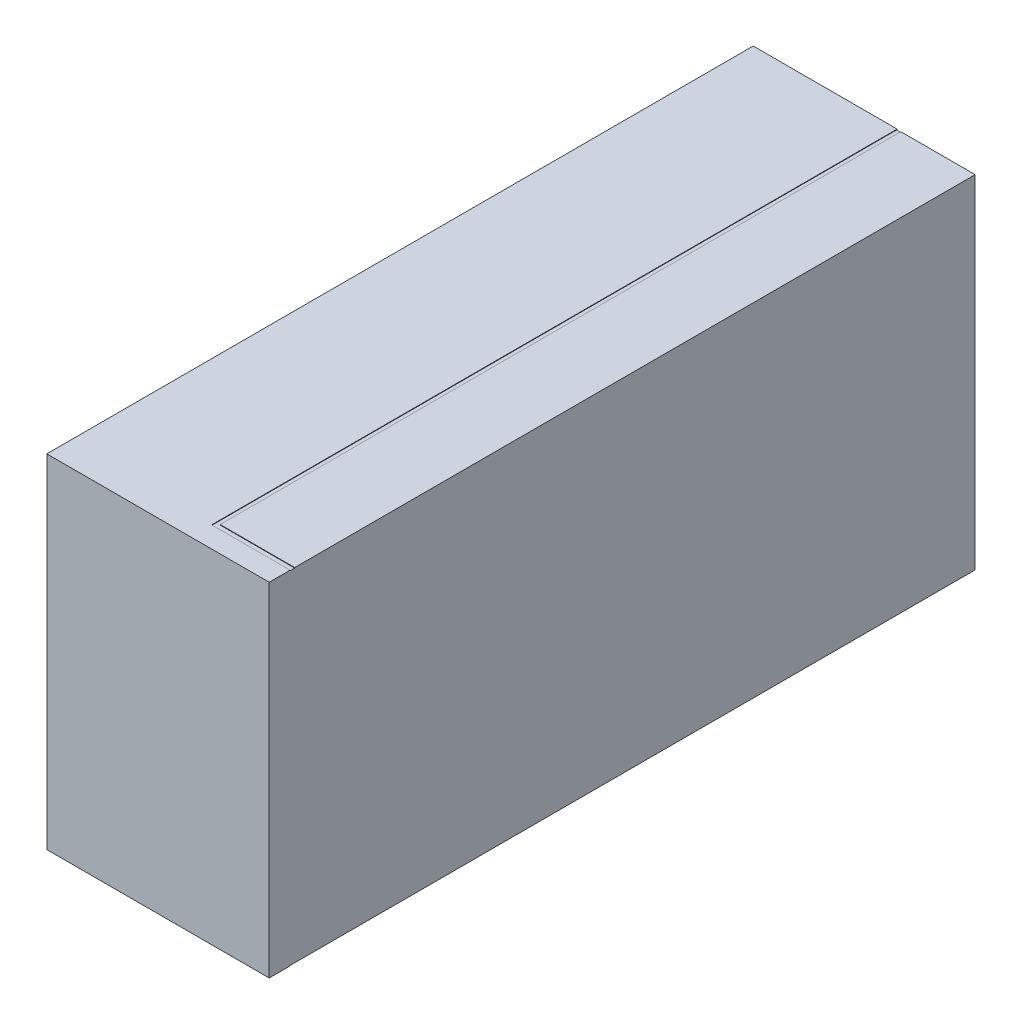
ISO-10303-21;
HEADER;
FILE_DESCRIPTION(('STEP AP214'),'2;1');
FILE_NAME('part.step','',(''),(''),'','','');
FILE_SCHEMA(('AUTOMOTIVE_DESIGN { 1 0 10303 214 1 1 1 1 }'));
ENDSEC;
DATA;
#1=APPLICATION_CONTEXT('core data for automotive mechanical design processes');
#2=APPLICATION_PROTOCOL_DEFINITION('international standard','automotive_design',2000,#1);
#3=PRODUCT_CONTEXT('',#1,'mechanical');
#4=PRODUCT('Part','Part','',(#3));
#5=PRODUCT_RELATED_PRODUCT_CATEGORY('part','',(#4));
#6=PRODUCT_DEFINITION_FORMATION('','',#4);
#7=PRODUCT_DEFINITION_CONTEXT('part definition',#1,'design');
#8=PRODUCT_DEFINITION('design','',#6,#7);
#9=PRODUCT_DEFINITION_SHAPE('','',#8);
#10=(LENGTH_UNIT() NAMED_UNIT(*) SI_UNIT(.MILLI.,.METRE.));
#11=(NAMED_UNIT(*) PLANE_ANGLE_UNIT() SI_UNIT($,.RADIAN.));
#12=(NAMED_UNIT(*) SI_UNIT($,.STERADIAN.) SOLID_ANGLE_UNIT());
#13=UNCERTAINTY_MEASURE_WITH_UNIT(LENGTH_MEASURE(1.E-05),#10,'distance_accuracy_value','');
#14=(GEOMETRIC_REPRESENTATION_CONTEXT(3) GLOBAL_UNCERTAINTY_ASSIGNED_CONTEXT((#13)) GLOBAL_UNIT_ASSIGNED_CONTEXT((#10,
#11,#12)) REPRESENTATION_CONTEXT('',''));
#15=CARTESIAN_POINT('',(0.,0.,0.));
#16=DIRECTION('',(0.,0.,1.));
#17=DIRECTION('',(1.,0.,0.));
#18=AXIS2_PLACEMENT_3D('',#15,#16,#17);
#19=CARTESIAN_POINT('',(3.,0.,0.));
#20=DIRECTION('',(1.,0.,0.));
#21=DIRECTION('',(0.,0.,-1.));
#22=AXIS2_PLACEMENT_3D('',#19,#20,#21);
#23=PLANE('',#22);
#24=DIRECTION('',(0.,0.,1.));
#25=VECTOR('',#24,1.);
#26=CARTESIAN_POINT('',(3.,-0.345095944246211,-32.2670870125813));
#27=LINE('',#26,#25);
#28=CARTESIAN_POINT('',(3.,-0.345095944246211,-30.5350362050125));
#29=VERTEX_POINT('',#28);
#30=CARTESIAN_POINT('',(3.,-0.345095944246211,-21.9991378201502));
#31=VERTEX_POINT('',#30);
#32=EDGE_CURVE('E259',#29,#31,#27,.T.);
#33=ORIENTED_EDGE('',*,*,#32,.T.);
#34=DIRECTION('',(0.,1.,0.));
#35=VECTOR('',#34,1.);
#36=CARTESIAN_POINT('',(3.,12.9228532481849,-21.9991378201502));
#37=LINE('',#36,#35);
#38=CARTESIAN_POINT('',(3.,11.190802440616,-21.9991378201502));
#39=VERTEX_POINT('',#38);
#40=EDGE_CURVE('E273',#39,#31,#37,.F.);
#41=ORIENTED_EDGE('',*,*,#40,.F.);
#42=DIRECTION('',(0.,0.,-1.));
#43=VECTOR('',#42,1.);
#44=CARTESIAN_POINT('',(3.,11.190802440616,-32.2670870125813));
#45=LINE('',#44,#43);
#46=CARTESIAN_POINT('',(3.,11.190802440616,-30.5350362050125));
#47=VERTEX_POINT('',#46);
#48=EDGE_CURVE('E276',#47,#39,#45,.F.);
#49=ORIENTED_EDGE('',*,*,#48,.F.);
#50=DIRECTION('',(0.,-1.,0.));
#51=VECTOR('',#50,1.);
#52=CARTESIAN_POINT('',(3.,12.9228532481849,-30.5350362050125));
#53=LINE('',#52,#51);
#54=EDGE_CURVE('E268',#47,#29,#53,.T.);
#55=ORIENTED_EDGE('',*,*,#54,.T.);
#56=EDGE_LOOP('',(#33,#41,#49,#55));
#57=FACE_BOUND('',#56,.T.);
#58=DIRECTION('',(0.,0.,1.));
#59=VECTOR('',#58,1.);
#60=CARTESIAN_POINT('',(3.,6.91288799864509,-29.9923067551688));
#61=LINE('',#60,#59);
#62=CARTESIAN_POINT('',(3.,6.91288799864509,-29.9923067551688));
#63=VERTEX_POINT('',#62);
#64=CARTESIAN_POINT('',(3.,6.91288799864509,-22.4836669984834));
#65=VERTEX_POINT('',#64);
#66=EDGE_CURVE('E225',#63,#65,#61,.T.);
#67=ORIENTED_EDGE('',*,*,#66,.F.);
#68=DIRECTION('',(0.,-1.,0.));
#69=VECTOR('',#68,1.);
#70=CARTESIAN_POINT('',(3.,10.1848527076385,-29.9923067551688));
#71=LINE('',#70,#69);
#72=CARTESIAN_POINT('',(3.,10.1848527076385,-29.9923067551688));
#73=VERTEX_POINT('',#72);
#74=EDGE_CURVE('E220',#73,#63,#71,.T.);
#75=ORIENTED_EDGE('',*,*,#74,.F.);
#76=DIRECTION('',(0.,0.,1.));
#77=VECTOR('',#76,1.);
#78=CARTESIAN_POINT('',(3.,10.1848527076385,-29.9923067551688));
#79=LINE('',#78,#77);
#80=CARTESIAN_POINT('',(3.,10.1848527076385,-22.4836669984834));
#81=VERTEX_POINT('',#80);
#82=EDGE_CURVE('E54',#73,#81,#79,.T.);
#83=ORIENTED_EDGE('',*,*,#82,.T.);
#84=DIRECTION('',(0.,-1.,0.));
#85=VECTOR('',#84,1.);
#86=CARTESIAN_POINT('',(3.,10.1848527076385,-22.4836669984834));
#87=LINE('',#86,#85);
#88=EDGE_CURVE('E49',#81,#65,#87,.T.);
#89=ORIENTED_EDGE('',*,*,#88,.T.);
#90=EDGE_LOOP('',(#67,#75,#83,#89));
#91=FACE_BOUND('',#90,.T.);
#92=ADVANCED_FACE('F34',(#57,#91),#23,.F.);
#93=CARTESIAN_POINT('',(0.,-16.325,0.));
#94=DIRECTION('',(0.,-1.,0.));
#95=DIRECTION('',(0.,0.,-1.));
#96=AXIS2_PLACEMENT_3D('',#93,#94,#95);
#97=PLANE('',#96);
#98=DIRECTION('',(0.,0.,-1.));
#99=VECTOR('',#98,1.);
#100=CARTESIAN_POINT('',(14.1102058435065,-16.325,-33.71));
#101=LINE('',#100,#99);
#102=CARTESIAN_POINT('',(14.1102058435065,-16.325,31.3360803535333));
#103=VERTEX_POINT('',#102);
#104=CARTESIAN_POINT('',(14.1102058435065,-16.325,-33.7));
#105=VERTEX_POINT('',#104);
#106=EDGE_CURVE('E293',#103,#105,#101,.T.);
#107=ORIENTED_EDGE('',*,*,#106,.F.);
#108=DIRECTION('',(-1.,0.,0.));
#109=VECTOR('',#108,1.);
#110=CARTESIAN_POINT('',(21.25,-16.325,31.3360803535333));
#111=LINE('',#110,#109);
#112=CARTESIAN_POINT('',(21.25,-16.325,31.3360803535333));
#113=VERTEX_POINT('',#112);
#114=EDGE_CURVE('E262',#113,#103,#111,.T.);
#115=ORIENTED_EDGE('',*,*,#114,.F.);
#116=DIRECTION('',(0.,0.,1.));
#117=VECTOR('',#116,1.);
#118=CARTESIAN_POINT('',(21.25,-16.325,-33.7));
#119=LINE('',#118,#117);
#120=CARTESIAN_POINT('',(21.25,-16.325,31.75));
#121=VERTEX_POINT('',#120);
#122=EDGE_CURVE('E345',#113,#121,#119,.T.);
#123=ORIENTED_EDGE('',*,*,#122,.T.);
#124=DIRECTION('',(-1.,0.,0.));
#125=VECTOR('',#124,1.);
#126=CARTESIAN_POINT('',(21.25,-16.325,31.75));
#127=LINE('',#126,#125);
#128=CARTESIAN_POINT('',(13.75,-16.325,31.75));
#129=VERTEX_POINT('',#128);
#130=EDGE_CURVE('E347',#121,#129,#127,.T.);
#131=ORIENTED_EDGE('',*,*,#130,.T.);
#132=DIRECTION('',(0.,0.,-1.));
#133=VECTOR('',#132,1.);
#134=CARTESIAN_POINT('',(13.75,-16.325,-33.7));
#135=LINE('',#134,#133);
#136=CARTESIAN_POINT('',(13.75,-16.325,-33.7));
#137=VERTEX_POINT('',#136);
#138=EDGE_CURVE('E350',#129,#137,#135,.T.);
#139=ORIENTED_EDGE('',*,*,#138,.T.);
#140=DIRECTION('',(1.,0.,0.));
#141=VECTOR('',#140,1.);
#142=CARTESIAN_POINT('',(21.25,-16.325,-33.7));
#143=LINE('',#142,#141);
#144=EDGE_CURVE('E352',#137,#105,#143,.T.);
#145=ORIENTED_EDGE('',*,*,#144,.T.);
#146=EDGE_LOOP('',(#107,#115,#123,#131,#139,#145));
#147=FACE_BOUND('',#146,.T.);
#148=ADVANCED_FACE('F459',(#147),#97,.T.);
#149=CARTESIAN_POINT('',(0.,0.,-33.7));
#150=DIRECTION('',(0.,0.,1.));
#151=DIRECTION('',(1.,0.,0.));
#152=AXIS2_PLACEMENT_3D('',#149,#150,#151);
#153=PLANE('',#152);
#154=DIRECTION('',(0.,1.,0.));
#155=VECTOR('',#154,1.);
#156=CARTESIAN_POINT('',(14.3548517665527,16.375,-33.7));
#157=LINE('',#156,#155);
#158=CARTESIAN_POINT('',(14.3548517665527,-16.325,-33.7));
#159=VERTEX_POINT('',#158);
#160=CARTESIAN_POINT('',(14.3548517665527,16.375,-33.7));
#161=VERTEX_POINT('',#160);
#162=EDGE_CURVE('E306',#159,#161,#157,.T.);
#163=ORIENTED_EDGE('',*,*,#162,.F.);
#164=DIRECTION('',(1.,0.,0.));
#165=VECTOR('',#164,1.);
#166=CARTESIAN_POINT('',(0.,-16.325,-33.7));
#167=LINE('',#166,#165);
#168=EDGE_CURVE('E304',#105,#159,#167,.T.);
#169=ORIENTED_EDGE('',*,*,#168,.F.);
#170=ORIENTED_EDGE('',*,*,#144,.F.);
#171=DIRECTION('',(0.,1.,0.));
#172=VECTOR('',#171,1.);
#173=CARTESIAN_POINT('',(13.75,16.325,-33.7));
#174=LINE('',#173,#172);
#175=CARTESIAN_POINT('',(13.75,16.325,-33.7));
#176=VERTEX_POINT('',#175);
#177=EDGE_CURVE('E361',#137,#176,#174,.T.);
#178=ORIENTED_EDGE('',*,*,#177,.T.);
#179=DIRECTION('',(1.,0.,0.));
#180=VECTOR('',#179,1.);
#181=CARTESIAN_POINT('',(13.75,16.325,-33.7));
#182=LINE('',#181,#180);
#183=CARTESIAN_POINT('',(14.1300583955491,16.325,-33.7));
#184=VERTEX_POINT('',#183);
#185=EDGE_CURVE('E364',#176,#184,#182,.T.);
#186=ORIENTED_EDGE('',*,*,#185,.T.);
#187=DIRECTION('',(0.,-1.,0.));
#188=VECTOR('',#187,1.);
#189=CARTESIAN_POINT('',(14.1300583955491,16.375,-33.7));
#190=LINE('',#189,#188);
#191=CARTESIAN_POINT('',(14.1300583955491,16.375,-33.7));
#192=VERTEX_POINT('',#191);
#193=EDGE_CURVE('E341',#192,#184,#190,.T.);
#194=ORIENTED_EDGE('',*,*,#193,.F.);
#195=DIRECTION('',(-1.,0.,0.));
#196=VECTOR('',#195,1.);
#197=CARTESIAN_POINT('',(21.25,16.375,-33.7));
#198=LINE('',#197,#196);
#199=EDGE_CURVE('E324',#161,#192,#198,.T.);
#200=ORIENTED_EDGE('',*,*,#199,.F.);
#201=EDGE_LOOP('',(#163,#169,#170,#178,#186,#194,#200));
#202=FACE_BOUND('',#201,.T.);
#203=ADVANCED_FACE('F454',(#202),#153,.F.);
#204=CARTESIAN_POINT('',(21.25,16.325,33.75));
#205=DIRECTION('',(0.,-1.,0.));
#206=DIRECTION('',(0.,0.,-1.));
#207=AXIS2_PLACEMENT_3D('',#204,#205,#206);
#208=PLANE('',#207);
#209=DIRECTION('',(0.,0.,1.));
#210=VECTOR('',#209,1.);
#211=CARTESIAN_POINT('',(14.1300583955491,16.325,-33.7));
#212=LINE('',#211,#210);
#213=CARTESIAN_POINT('',(14.1300583955491,16.325,31.3137362520566));
#214=VERTEX_POINT('',#213);
#215=EDGE_CURVE('E321',#184,#214,#212,.T.);
#216=ORIENTED_EDGE('',*,*,#215,.F.);
#217=ORIENTED_EDGE('',*,*,#185,.F.);
#218=DIRECTION('',(0.,0.,-1.));
#219=VECTOR('',#218,1.);
#220=CARTESIAN_POINT('',(13.75,16.325,-33.75));
#221=LINE('',#220,#219);
#222=CARTESIAN_POINT('',(13.75,16.325,31.7470793210036));
#223=VERTEX_POINT('',#222);
#224=EDGE_CURVE('E374',#223,#176,#221,.T.);
#225=ORIENTED_EDGE('',*,*,#224,.F.);
#226=DIRECTION('',(-1.,0.,0.));
#227=VECTOR('',#226,1.);
#228=CARTESIAN_POINT('',(13.75,16.325,31.7470793210036));
#229=LINE('',#228,#227);
#230=CARTESIAN_POINT('',(21.25,16.325,31.7470793210036));
#231=VERTEX_POINT('',#230);
#232=EDGE_CURVE('E371',#231,#223,#229,.T.);
#233=ORIENTED_EDGE('',*,*,#232,.F.);
#234=DIRECTION('',(0.,0.,1.));
#235=VECTOR('',#234,1.);
#236=CARTESIAN_POINT('',(21.25,16.325,33.75));
#237=LINE('',#236,#235);
#238=CARTESIAN_POINT('',(21.25,16.325,31.3137362520566));
#239=VERTEX_POINT('',#238);
#240=EDGE_CURVE('E370',#239,#231,#237,.T.);
#241=ORIENTED_EDGE('',*,*,#240,.F.);
#242=DIRECTION('',(1.,0.,0.));
#243=VECTOR('',#242,1.);
#244=CARTESIAN_POINT('',(21.25,16.325,31.3137362520566));
#245=LINE('',#244,#243);
#246=EDGE_CURVE('E325',#214,#239,#245,.T.);
#247=ORIENTED_EDGE('',*,*,#246,.F.);
#248=EDGE_LOOP('',(#216,#217,#225,#233,#241,#247));
#249=FACE_BOUND('',#248,.T.);
#250=ADVANCED_FACE('F448',(#249),#208,.F.);
#251=CARTESIAN_POINT('',(21.25,-16.375,-33.75));
#252=DIRECTION('',(0.,0.,1.));
#253=DIRECTION('',(1.,0.,0.));
#254=AXIS2_PLACEMENT_3D('',#251,#252,#253);
#255=PLANE('',#254);
#256=CARTESIAN_POINT('',(10.25,-10.875,-33.75));
#257=DIRECTION('',(0.,0.,-1.));
#258=DIRECTION('',(-1.,0.,0.));
#259=AXIS2_PLACEMENT_3D('',#256,#257,#258);
#260=CIRCLE('',#259,2.5);
#261=CARTESIAN_POINT('',(7.75,-10.875,-33.75));
#262=VERTEX_POINT('',#261);
#263=EDGE_CURVE('E792',#262,#262,#260,.T.);
#264=ORIENTED_EDGE('',*,*,#263,.F.);
#265=EDGE_LOOP('',(#264));
#266=FACE_BOUND('',#265,.T.);
#267=DIRECTION('',(0.,-1.,0.));
#268=VECTOR('',#267,1.);
#269=CARTESIAN_POINT('',(13.75,113.845949197697,-33.75));
#270=LINE('',#269,#268);
#271=CARTESIAN_POINT('',(13.75,16.375,-33.75));
#272=VERTEX_POINT('',#271);
#273=CARTESIAN_POINT('',(13.75,-16.375,-33.75));
#274=VERTEX_POINT('',#273);
#275=EDGE_CURVE('E389',#272,#274,#270,.T.);
#276=ORIENTED_EDGE('',*,*,#275,.T.);
#277=DIRECTION('',(-1.,0.,0.));
#278=VECTOR('',#277,1.);
#279=CARTESIAN_POINT('',(21.25,-16.375,-33.75));
#280=LINE('',#279,#278);
#281=CARTESIAN_POINT('',(0.,-16.375,-33.75));
#282=VERTEX_POINT('',#281);
#283=EDGE_CURVE('E401',#274,#282,#280,.T.);
#284=ORIENTED_EDGE('',*,*,#283,.T.);
#285=DIRECTION('',(0.,1.,0.));
#286=VECTOR('',#285,1.);
#287=CARTESIAN_POINT('',(0.,-16.375,-33.75));
#288=LINE('',#287,#286);
#289=CARTESIAN_POINT('',(0.,16.375,-33.75));
#290=VERTEX_POINT('',#289);
#291=EDGE_CURVE('E391',#282,#290,#288,.T.);
#292=ORIENTED_EDGE('',*,*,#291,.T.);
#293=DIRECTION('',(-1.,0.,0.));
#294=VECTOR('',#293,1.);
#295=CARTESIAN_POINT('',(21.25,16.375,-33.75));
#296=LINE('',#295,#294);
#297=EDGE_CURVE('E11',#272,#290,#296,.T.);
#298=ORIENTED_EDGE('',*,*,#297,.F.);
#299=EDGE_LOOP('',(#276,#284,#292,#298));
#300=FACE_BOUND('',#299,.T.);
#301=ADVANCED_FACE('F36',(#266,#300),#255,.F.);
#302=CARTESIAN_POINT('',(21.25,16.375,33.75));
#303=DIRECTION('',(0.,-1.,0.));
#304=DIRECTION('',(0.,0.,-1.));
#305=AXIS2_PLACEMENT_3D('',#302,#303,#304);
#306=PLANE('',#305);
#307=DIRECTION('',(0.,0.,-1.));
#308=VECTOR('',#307,1.);
#309=CARTESIAN_POINT('',(13.75,16.375,-33.75));
#310=LINE('',#309,#308);
#311=CARTESIAN_POINT('',(13.75,16.375,31.7470793210036));
#312=VERTEX_POINT('',#311);
#313=EDGE_CURVE('E379',#312,#272,#310,.T.);
#314=ORIENTED_EDGE('',*,*,#313,.T.);
#315=ORIENTED_EDGE('',*,*,#297,.T.);
#316=DIRECTION('',(0.,0.,1.));
#317=VECTOR('',#316,1.);
#318=CARTESIAN_POINT('',(0.,16.375,33.75));
#319=LINE('',#318,#317);
#320=CARTESIAN_POINT('',(0.,16.375,33.75));
#321=VERTEX_POINT('',#320);
#322=EDGE_CURVE('E404',#290,#321,#319,.T.);
#323=ORIENTED_EDGE('',*,*,#322,.T.);
#324=DIRECTION('',(-1.,0.,0.));
#325=VECTOR('',#324,1.);
#326=CARTESIAN_POINT('',(21.25,16.375,33.75));
#327=LINE('',#326,#325);
#328=CARTESIAN_POINT('',(21.25,16.375,33.75));
#329=VERTEX_POINT('',#328);
#330=EDGE_CURVE('E42',#329,#321,#327,.T.);
#331=ORIENTED_EDGE('',*,*,#330,.F.);
#332=DIRECTION('',(0.,0.,1.));
#333=VECTOR('',#332,1.);
#334=CARTESIAN_POINT('',(21.25,16.375,33.75));
#335=LINE('',#334,#333);
#336=CARTESIAN_POINT('',(21.25,16.375,31.7470793210036));
#337=VERTEX_POINT('',#336);
#338=EDGE_CURVE('E393',#337,#329,#335,.T.);
#339=ORIENTED_EDGE('',*,*,#338,.F.);
#340=DIRECTION('',(-1.,0.,0.));
#341=VECTOR('',#340,1.);
#342=CARTESIAN_POINT('',(13.75,16.375,31.7470793210036));
#343=LINE('',#342,#341);
#344=EDGE_CURVE('E375',#337,#312,#343,.T.);
#345=ORIENTED_EDGE('',*,*,#344,.T.);
#346=EDGE_LOOP('',(#314,#315,#323,#331,#339,#345));
#347=FACE_BOUND('',#346,.T.);
#348=ADVANCED_FACE('F437',(#347),#306,.F.);
#349=CARTESIAN_POINT('',(21.25,0.,0.));
#350=DIRECTION('',(-1.,0.,0.));
#351=DIRECTION('',(0.,0.,1.));
#352=AXIS2_PLACEMENT_3D('',#349,#350,#351);
#353=PLANE('',#352);
#354=DIRECTION('',(0.,0.,-1.));
#355=VECTOR('',#354,1.);
#356=CARTESIAN_POINT('',(21.25,-16.375,33.75));
#357=LINE('',#356,#355);
#358=CARTESIAN_POINT('',(21.25,-16.375,33.75));
#359=VERTEX_POINT('',#358);
#360=CARTESIAN_POINT('',(21.25,-16.375,31.75));
#361=VERTEX_POINT('',#360);
#362=EDGE_CURVE('E398',#359,#361,#357,.T.);
#363=ORIENTED_EDGE('',*,*,#362,.T.);
#364=DIRECTION('',(0.,-1.,0.));
#365=VECTOR('',#364,1.);
#366=CARTESIAN_POINT('',(21.25,-16.325,31.75));
#367=LINE('',#366,#365);
#368=EDGE_CURVE('E355',#121,#361,#367,.T.);
#369=ORIENTED_EDGE('',*,*,#368,.F.);
#370=ORIENTED_EDGE('',*,*,#122,.F.);
#371=DIRECTION('',(0.,1.,0.));
#372=VECTOR('',#371,1.);
#373=CARTESIAN_POINT('',(21.25,-16.335,31.3360803535333));
#374=LINE('',#373,#372);
#375=CARTESIAN_POINT('',(21.25,-16.335,31.3360803535333));
#376=VERTEX_POINT('',#375);
#377=EDGE_CURVE('E302',#376,#113,#374,.T.);
#378=ORIENTED_EDGE('',*,*,#377,.F.);
#379=DIRECTION('',(0.,0.,1.));
#380=VECTOR('',#379,1.);
#381=CARTESIAN_POINT('',(21.25,-16.335,-33.71));
#382=LINE('',#381,#380);
#383=CARTESIAN_POINT('',(21.25,-16.335,-33.71));
#384=VERTEX_POINT('',#383);
#385=EDGE_CURVE('E279',#384,#376,#382,.T.);
#386=ORIENTED_EDGE('',*,*,#385,.F.);
#387=DIRECTION('',(0.,-1.,0.));
#388=VECTOR('',#387,1.);
#389=CARTESIAN_POINT('',(21.25,16.375,-33.71));
#390=LINE('',#389,#388);
#391=CARTESIAN_POINT('',(21.25,16.375,-33.71));
#392=VERTEX_POINT('',#391);
#393=EDGE_CURVE('E307',#392,#384,#390,.T.);
#394=ORIENTED_EDGE('',*,*,#393,.F.);
#395=DIRECTION('',(0.,0.,-1.));
#396=VECTOR('',#395,1.);
#397=CARTESIAN_POINT('',(21.25,16.375,-33.7));
#398=LINE('',#397,#396);
#399=CARTESIAN_POINT('',(21.25,16.375,31.3137362520566));
#400=VERTEX_POINT('',#399);
#401=EDGE_CURVE('E322',#400,#392,#398,.T.);
#402=ORIENTED_EDGE('',*,*,#401,.F.);
#403=DIRECTION('',(0.,-1.,0.));
#404=VECTOR('',#403,1.);
#405=CARTESIAN_POINT('',(21.25,16.375,31.3137362520566));
#406=LINE('',#405,#404);
#407=EDGE_CURVE('E331',#400,#239,#406,.T.);
#408=ORIENTED_EDGE('',*,*,#407,.T.);
#409=ORIENTED_EDGE('',*,*,#240,.T.);
#410=DIRECTION('',(0.,-1.,0.));
#411=VECTOR('',#410,1.);
#412=CARTESIAN_POINT('',(21.25,113.845949197697,31.7470793210036));
#413=LINE('',#412,#411);
#414=EDGE_CURVE('E378',#337,#231,#413,.T.);
#415=ORIENTED_EDGE('',*,*,#414,.F.);
#416=ORIENTED_EDGE('',*,*,#338,.T.);
#417=DIRECTION('',(0.,-1.,0.));
#418=VECTOR('',#417,1.);
#419=CARTESIAN_POINT('',(21.25,-16.375,33.75));
#420=LINE('',#419,#418);
#421=EDGE_CURVE('E395',#329,#359,#420,.T.);
#422=ORIENTED_EDGE('',*,*,#421,.T.);
#423=EDGE_LOOP('',(#363,#369,#370,#378,#386,#394,#402,#408,#409,#415,#416,#422));
#424=FACE_BOUND('',#423,.T.);
#425=ADVANCED_FACE('F434',(#424),#353,.F.);
#426=CARTESIAN_POINT('',(21.25,-16.375,33.75));
#427=DIRECTION('',(0.,0.,-1.));
#428=DIRECTION('',(-1.,0.,0.));
#429=AXIS2_PLACEMENT_3D('',#426,#427,#428);
#430=PLANE('',#429);
#431=DIRECTION('',(0.,-1.,0.));
#432=VECTOR('',#431,1.);
#433=CARTESIAN_POINT('',(0.,-16.375,33.75));
#434=LINE('',#433,#432);
#435=CARTESIAN_POINT('',(0.,-16.375,33.75));
#436=VERTEX_POINT('',#435);
#437=EDGE_CURVE('E406',#321,#436,#434,.T.);
#438=ORIENTED_EDGE('',*,*,#437,.T.);
#439=DIRECTION('',(-1.,0.,0.));
#440=VECTOR('',#439,1.);
#441=CARTESIAN_POINT('',(21.25,-16.375,33.75));
#442=LINE('',#441,#440);
#443=EDGE_CURVE('E411',#359,#436,#442,.T.);
#444=ORIENTED_EDGE('',*,*,#443,.F.);
#445=ORIENTED_EDGE('',*,*,#421,.F.);
#446=ORIENTED_EDGE('',*,*,#330,.T.);
#447=EDGE_LOOP('',(#438,#444,#445,#446));
#448=FACE_BOUND('',#447,.T.);
#449=ADVANCED_FACE('F418',(#448),#430,.F.);
#450=CARTESIAN_POINT('',(21.25,-16.375,33.75));
#451=DIRECTION('',(0.,1.,0.));
#452=DIRECTION('',(0.,0.,1.));
#453=AXIS2_PLACEMENT_3D('',#450,#451,#452);
#454=PLANE('',#453);
#455=DIRECTION('',(0.,0.,-1.));
#456=VECTOR('',#455,1.);
#457=CARTESIAN_POINT('',(13.75,-16.375,-33.7));
#458=LINE('',#457,#456);
#459=CARTESIAN_POINT('',(13.75,-16.375,31.75));
#460=VERTEX_POINT('',#459);
#461=EDGE_CURVE('E367',#460,#274,#458,.T.);
#462=ORIENTED_EDGE('',*,*,#461,.F.);
#463=DIRECTION('',(-1.,0.,0.));
#464=VECTOR('',#463,1.);
#465=CARTESIAN_POINT('',(21.25,-16.375,31.75));
#466=LINE('',#465,#464);
#467=EDGE_CURVE('E344',#361,#460,#466,.T.);
#468=ORIENTED_EDGE('',*,*,#467,.F.);
#469=ORIENTED_EDGE('',*,*,#362,.F.);
#470=ORIENTED_EDGE('',*,*,#443,.T.);
#471=DIRECTION('',(0.,0.,-1.));
#472=VECTOR('',#471,1.);
#473=CARTESIAN_POINT('',(0.,-16.375,33.75));
#474=LINE('',#473,#472);
#475=EDGE_CURVE('E396',#436,#282,#474,.T.);
#476=ORIENTED_EDGE('',*,*,#475,.T.);
#477=ORIENTED_EDGE('',*,*,#283,.F.);
#478=EDGE_LOOP('',(#462,#468,#469,#470,#476,#477));
#479=FACE_BOUND('',#478,.T.);
#480=ADVANCED_FACE('F429',(#479),#454,.F.);
#481=CARTESIAN_POINT('',(0.,0.,0.));
#482=DIRECTION('',(-1.,0.,0.));
#483=DIRECTION('',(0.,0.,1.));
#484=AXIS2_PLACEMENT_3D('',#481,#482,#483);
#485=PLANE('',#484);
#486=DIRECTION('',(0.,0.,1.));
#487=VECTOR('',#486,1.);
#488=CARTESIAN_POINT('',(0.,-2.07714675181509,-32.2670870125813));
#489=LINE('',#488,#487);
#490=CARTESIAN_POINT('',(0.,-2.07714675181509,-32.2670870125813));
#491=VERTEX_POINT('',#490);
#492=CARTESIAN_POINT('',(0.,-2.07714675181509,-20.2670870125813));
#493=VERTEX_POINT('',#492);
#494=EDGE_CURVE('E227',#491,#493,#489,.T.);
#495=ORIENTED_EDGE('',*,*,#494,.F.);
#496=DIRECTION('',(0.,-1.,0.));
#497=VECTOR('',#496,1.);
#498=CARTESIAN_POINT('',(0.,12.9228532481849,-32.2670870125813));
#499=LINE('',#498,#497);
#500=CARTESIAN_POINT('',(0.,12.9228532481849,-32.2670870125813));
#501=VERTEX_POINT('',#500);
#502=EDGE_CURVE('E256',#501,#491,#499,.T.);
#503=ORIENTED_EDGE('',*,*,#502,.F.);
#504=DIRECTION('',(0.,0.,1.));
#505=VECTOR('',#504,1.);
#506=CARTESIAN_POINT('',(0.,12.9228532481849,-32.2670870125813));
#507=LINE('',#506,#505);
#508=CARTESIAN_POINT('',(0.,12.9228532481849,-20.2670870125813));
#509=VERTEX_POINT('',#508);
#510=EDGE_CURVE('E253',#501,#509,#507,.T.);
#511=ORIENTED_EDGE('',*,*,#510,.T.);
#512=DIRECTION('',(0.,-1.,0.));
#513=VECTOR('',#512,1.);
#514=CARTESIAN_POINT('',(0.,12.9228532481849,-20.2670870125813));
#515=LINE('',#514,#513);
#516=EDGE_CURVE('E250',#509,#493,#515,.T.);
#517=ORIENTED_EDGE('',*,*,#516,.T.);
#518=EDGE_LOOP('',(#495,#503,#511,#517));
#519=FACE_BOUND('',#518,.T.);
#520=ORIENTED_EDGE('',*,*,#291,.F.);
#521=ORIENTED_EDGE('',*,*,#475,.F.);
#522=ORIENTED_EDGE('',*,*,#437,.F.);
#523=ORIENTED_EDGE('',*,*,#322,.F.);
#524=EDGE_LOOP('',(#520,#521,#522,#523));
#525=FACE_BOUND('',#524,.T.);
#526=ADVANCED_FACE('F426',(#519,#525),#485,.T.);
#527=CARTESIAN_POINT('',(13.75,113.845949197697,-33.75));
#528=DIRECTION('',(1.,0.,0.));
#529=DIRECTION('',(0.,0.,-1.));
#530=AXIS2_PLACEMENT_3D('',#527,#528,#529);
#531=PLANE('',#530);
#532=ORIENTED_EDGE('',*,*,#313,.F.);
#533=DIRECTION('',(0.,-1.,0.));
#534=VECTOR('',#533,1.);
#535=CARTESIAN_POINT('',(13.75,113.845949197697,31.7470793210036));
#536=LINE('',#535,#534);
#537=EDGE_CURVE('E386',#312,#223,#536,.T.);
#538=ORIENTED_EDGE('',*,*,#537,.T.);
#539=ORIENTED_EDGE('',*,*,#224,.T.);
#540=ORIENTED_EDGE('',*,*,#177,.F.);
#541=ORIENTED_EDGE('',*,*,#138,.F.);
#542=DIRECTION('',(0.,-1.,0.));
#543=VECTOR('',#542,1.);
#544=CARTESIAN_POINT('',(13.75,-16.325,31.75));
#545=LINE('',#544,#543);
#546=EDGE_CURVE('E358',#129,#460,#545,.T.);
#547=ORIENTED_EDGE('',*,*,#546,.T.);
#548=ORIENTED_EDGE('',*,*,#461,.T.);
#549=ORIENTED_EDGE('',*,*,#275,.F.);
#550=EDGE_LOOP('',(#532,#538,#539,#540,#541,#547,#548,#549));
#551=FACE_BOUND('',#550,.T.);
#552=ADVANCED_FACE('F444',(#551),#531,.T.);
#553=CARTESIAN_POINT('',(13.75,113.845949197697,31.7470793210036));
#554=DIRECTION('',(0.,0.,-1.));
#555=DIRECTION('',(-1.,0.,0.));
#556=AXIS2_PLACEMENT_3D('',#553,#554,#555);
#557=PLANE('',#556);
#558=ORIENTED_EDGE('',*,*,#344,.F.);
#559=ORIENTED_EDGE('',*,*,#414,.T.);
#560=ORIENTED_EDGE('',*,*,#232,.T.);
#561=ORIENTED_EDGE('',*,*,#537,.F.);
#562=EDGE_LOOP('',(#558,#559,#560,#561));
#563=FACE_BOUND('',#562,.T.);
#564=ADVANCED_FACE('F441',(#563),#557,.T.);
#565=CARTESIAN_POINT('',(21.25,-16.325,31.75));
#566=DIRECTION('',(0.,0.,1.));
#567=DIRECTION('',(1.,0.,0.));
#568=AXIS2_PLACEMENT_3D('',#565,#566,#567);
#569=PLANE('',#568);
#570=ORIENTED_EDGE('',*,*,#467,.T.);
#571=ORIENTED_EDGE('',*,*,#546,.F.);
#572=ORIENTED_EDGE('',*,*,#130,.F.);
#573=ORIENTED_EDGE('',*,*,#368,.T.);
#574=EDGE_LOOP('',(#570,#571,#572,#573));
#575=FACE_BOUND('',#574,.T.);
#576=ADVANCED_FACE('F520',(#575),#569,.F.);
#577=CARTESIAN_POINT('',(14.1300583955491,16.375,-33.7));
#578=DIRECTION('',(1.,0.,0.));
#579=DIRECTION('',(0.,0.,-1.));
#580=AXIS2_PLACEMENT_3D('',#577,#578,#579);
#581=PLANE('',#580);
#582=ORIENTED_EDGE('',*,*,#215,.T.);
#583=DIRECTION('',(0.,-1.,0.));
#584=VECTOR('',#583,1.);
#585=CARTESIAN_POINT('',(14.1300583955491,16.375,31.3137362520566));
#586=LINE('',#585,#584);
#587=CARTESIAN_POINT('',(14.1300583955491,16.375,31.3137362520566));
#588=VERTEX_POINT('',#587);
#589=EDGE_CURVE('E338',#588,#214,#586,.T.);
#590=ORIENTED_EDGE('',*,*,#589,.F.);
#591=DIRECTION('',(0.,0.,1.));
#592=VECTOR('',#591,1.);
#593=CARTESIAN_POINT('',(14.1300583955491,16.375,-33.7));
#594=LINE('',#593,#592);
#595=EDGE_CURVE('E327',#192,#588,#594,.T.);
#596=ORIENTED_EDGE('',*,*,#595,.F.);
#597=ORIENTED_EDGE('',*,*,#193,.T.);
#598=EDGE_LOOP('',(#582,#590,#596,#597));
#599=FACE_BOUND('',#598,.T.);
#600=ADVANCED_FACE('F517',(#599),#581,.F.);
#601=CARTESIAN_POINT('',(21.25,16.375,31.3137362520566));
#602=DIRECTION('',(0.,0.,-1.));
#603=DIRECTION('',(-1.,0.,0.));
#604=AXIS2_PLACEMENT_3D('',#601,#602,#603);
#605=PLANE('',#604);
#606=ORIENTED_EDGE('',*,*,#246,.T.);
#607=ORIENTED_EDGE('',*,*,#407,.F.);
#608=DIRECTION('',(1.,0.,0.));
#609=VECTOR('',#608,1.);
#610=CARTESIAN_POINT('',(21.25,16.375,31.3137362520566));
#611=LINE('',#610,#609);
#612=EDGE_CURVE('E329',#588,#400,#611,.T.);
#613=ORIENTED_EDGE('',*,*,#612,.F.);
#614=ORIENTED_EDGE('',*,*,#589,.T.);
#615=EDGE_LOOP('',(#606,#607,#613,#614));
#616=FACE_BOUND('',#615,.T.);
#617=ADVANCED_FACE('F513',(#616),#605,.F.);
#618=CARTESIAN_POINT('',(0.,16.375,0.));
#619=DIRECTION('',(0.,-1.,0.));
#620=DIRECTION('',(0.,0.,-1.));
#621=AXIS2_PLACEMENT_3D('',#618,#619,#620);
#622=PLANE('',#621);
#623=ORIENTED_EDGE('',*,*,#401,.T.);
#624=DIRECTION('',(1.,0.,0.));
#625=VECTOR('',#624,1.);
#626=CARTESIAN_POINT('',(21.25,16.375,-33.71));
#627=LINE('',#626,#625);
#628=CARTESIAN_POINT('',(14.3548517665527,16.375,-33.71));
#629=VERTEX_POINT('',#628);
#630=EDGE_CURVE('E311',#629,#392,#627,.T.);
#631=ORIENTED_EDGE('',*,*,#630,.F.);
#632=DIRECTION('',(0.,0.,1.));
#633=VECTOR('',#632,1.);
#634=CARTESIAN_POINT('',(14.3548517665527,16.375,-33.71));
#635=LINE('',#634,#633);
#636=EDGE_CURVE('E314',#629,#161,#635,.T.);
#637=ORIENTED_EDGE('',*,*,#636,.T.);
#638=ORIENTED_EDGE('',*,*,#199,.T.);
#639=ORIENTED_EDGE('',*,*,#595,.T.);
#640=ORIENTED_EDGE('',*,*,#612,.T.);
#641=EDGE_LOOP('',(#623,#631,#637,#638,#639,#640));
#642=FACE_BOUND('',#641,.T.);
#643=ADVANCED_FACE('F509',(#642),#622,.F.);
#644=CARTESIAN_POINT('',(14.3548517665527,16.375,-33.71));
#645=DIRECTION('',(1.,0.,0.));
#646=DIRECTION('',(0.,0.,-1.));
#647=AXIS2_PLACEMENT_3D('',#644,#645,#646);
#648=PLANE('',#647);
#649=ORIENTED_EDGE('',*,*,#162,.T.);
#650=ORIENTED_EDGE('',*,*,#636,.F.);
#651=DIRECTION('',(0.,1.,0.));
#652=VECTOR('',#651,1.);
#653=CARTESIAN_POINT('',(14.3548517665527,16.375,-33.71));
#654=LINE('',#653,#652);
#655=CARTESIAN_POINT('',(14.3548517665527,-16.325,-33.71));
#656=VERTEX_POINT('',#655);
#657=EDGE_CURVE('E309',#656,#629,#654,.T.);
#658=ORIENTED_EDGE('',*,*,#657,.F.);
#659=DIRECTION('',(0.,0.,1.));
#660=VECTOR('',#659,1.);
#661=CARTESIAN_POINT('',(14.3548517665527,-16.325,-33.71));
#662=LINE('',#661,#660);
#663=EDGE_CURVE('E318',#656,#159,#662,.T.);
#664=ORIENTED_EDGE('',*,*,#663,.T.);
#665=EDGE_LOOP('',(#649,#650,#658,#664));
#666=FACE_BOUND('',#665,.T.);
#667=ADVANCED_FACE('F505',(#666),#648,.F.);
#668=CARTESIAN_POINT('',(0.,0.,-33.71));
#669=DIRECTION('',(0.,0.,-1.));
#670=DIRECTION('',(-1.,0.,0.));
#671=AXIS2_PLACEMENT_3D('',#668,#669,#670);
#672=PLANE('',#671);
#673=ORIENTED_EDGE('',*,*,#393,.T.);
#674=DIRECTION('',(1.,0.,0.));
#675=VECTOR('',#674,1.);
#676=CARTESIAN_POINT('',(21.25,-16.335,-33.71));
#677=LINE('',#676,#675);
#678=CARTESIAN_POINT('',(14.1102058435065,-16.335,-33.71));
#679=VERTEX_POINT('',#678);
#680=EDGE_CURVE('E287',#679,#384,#677,.T.);
#681=ORIENTED_EDGE('',*,*,#680,.F.);
#682=DIRECTION('',(0.,1.,0.));
#683=VECTOR('',#682,1.);
#684=CARTESIAN_POINT('',(14.1102058435065,-16.335,-33.71));
#685=LINE('',#684,#683);
#686=CARTESIAN_POINT('',(14.1102058435065,-16.325,-33.71));
#687=VERTEX_POINT('',#686);
#688=EDGE_CURVE('E290',#679,#687,#685,.T.);
#689=ORIENTED_EDGE('',*,*,#688,.T.);
#690=DIRECTION('',(1.,0.,0.));
#691=VECTOR('',#690,1.);
#692=CARTESIAN_POINT('',(21.25,-16.325,-33.71));
#693=LINE('',#692,#691);
#694=EDGE_CURVE('E283',#687,#656,#693,.T.);
#695=ORIENTED_EDGE('',*,*,#694,.T.);
#696=ORIENTED_EDGE('',*,*,#657,.T.);
#697=ORIENTED_EDGE('',*,*,#630,.T.);
#698=EDGE_LOOP('',(#673,#681,#689,#695,#696,#697));
#699=FACE_BOUND('',#698,.T.);
#700=ADVANCED_FACE('F495',(#699),#672,.T.);
#701=CARTESIAN_POINT('',(0.,-16.325,0.));
#702=DIRECTION('',(0.,-1.,0.));
#703=DIRECTION('',(0.,0.,-1.));
#704=AXIS2_PLACEMENT_3D('',#701,#702,#703);
#705=PLANE('',#704);
#706=EDGE_CURVE('E292',#105,#687,#101,.T.);
#707=ORIENTED_EDGE('',*,*,#706,.F.);
#708=ORIENTED_EDGE('',*,*,#168,.T.);
#709=ORIENTED_EDGE('',*,*,#663,.F.);
#710=ORIENTED_EDGE('',*,*,#694,.F.);
#711=EDGE_LOOP('',(#707,#708,#709,#710));
#712=FACE_BOUND('',#711,.T.);
#713=ADVANCED_FACE('F491',(#712),#705,.F.);
#714=CARTESIAN_POINT('',(21.25,-16.335,31.3360803535333));
#715=DIRECTION('',(0.,0.,-1.));
#716=DIRECTION('',(-1.,0.,0.));
#717=AXIS2_PLACEMENT_3D('',#714,#715,#716);
#718=PLANE('',#717);
#719=ORIENTED_EDGE('',*,*,#114,.T.);
#720=DIRECTION('',(0.,1.,0.));
#721=VECTOR('',#720,1.);
#722=CARTESIAN_POINT('',(14.1102058435065,-16.335,31.3360803535333));
#723=LINE('',#722,#721);
#724=CARTESIAN_POINT('',(14.1102058435065,-16.335,31.3360803535333));
#725=VERTEX_POINT('',#724);
#726=EDGE_CURVE('E299',#725,#103,#723,.T.);
#727=ORIENTED_EDGE('',*,*,#726,.F.);
#728=DIRECTION('',(-1.,0.,0.));
#729=VECTOR('',#728,1.);
#730=CARTESIAN_POINT('',(21.25,-16.335,31.3360803535333));
#731=LINE('',#730,#729);
#732=EDGE_CURVE('E282',#376,#725,#731,.T.);
#733=ORIENTED_EDGE('',*,*,#732,.F.);
#734=ORIENTED_EDGE('',*,*,#377,.T.);
#735=EDGE_LOOP('',(#719,#727,#733,#734));
#736=FACE_BOUND('',#735,.T.);
#737=ADVANCED_FACE('F494',(#736),#718,.F.);
#738=CARTESIAN_POINT('',(14.1102058435065,-16.335,-33.71));
#739=DIRECTION('',(1.,0.,0.));
#740=DIRECTION('',(0.,0.,-1.));
#741=AXIS2_PLACEMENT_3D('',#738,#739,#740);
#742=PLANE('',#741);
#743=ORIENTED_EDGE('',*,*,#106,.T.);
#744=ORIENTED_EDGE('',*,*,#706,.T.);
#745=ORIENTED_EDGE('',*,*,#688,.F.);
#746=DIRECTION('',(0.,0.,-1.));
#747=VECTOR('',#746,1.);
#748=CARTESIAN_POINT('',(14.1102058435065,-16.335,-33.71));
#749=LINE('',#748,#747);
#750=EDGE_CURVE('E285',#725,#679,#749,.T.);
#751=ORIENTED_EDGE('',*,*,#750,.F.);
#752=ORIENTED_EDGE('',*,*,#726,.T.);
#753=EDGE_LOOP('',(#743,#744,#745,#751,#752));
#754=FACE_BOUND('',#753,.T.);
#755=ADVANCED_FACE('F489',(#754),#742,.F.);
#756=CARTESIAN_POINT('',(0.,-16.335,0.));
#757=DIRECTION('',(0.,-1.,0.));
#758=DIRECTION('',(0.,0.,-1.));
#759=AXIS2_PLACEMENT_3D('',#756,#757,#758);
#760=PLANE('',#759);
#761=ORIENTED_EDGE('',*,*,#385,.T.);
#762=ORIENTED_EDGE('',*,*,#732,.T.);
#763=ORIENTED_EDGE('',*,*,#750,.T.);
#764=ORIENTED_EDGE('',*,*,#680,.T.);
#765=EDGE_LOOP('',(#761,#762,#763,#764));
#766=FACE_BOUND('',#765,.T.);
#767=ADVANCED_FACE('F474',(#766),#760,.T.);
#768=CARTESIAN_POINT('',(0.,-2.07714675181509,-32.2670870125813));
#769=DIRECTION('',(0.500000000000001,-0.866025403784438,0.));
#770=DIRECTION('',(0.866025403784438,0.500000000000001,0.));
#771=AXIS2_PLACEMENT_3D('',#768,#769,#770);
#772=PLANE('',#771);
#773=ORIENTED_EDGE('',*,*,#494,.T.);
#774=DIRECTION('',(0.774596669241482,0.447213595499959,-0.447213595499959));
#775=VECTOR('',#774,1.);
#776=CARTESIAN_POINT('',(5.19615242270664,0.922853248184918,-23.2670870125813));
#777=LINE('',#776,#775);
#778=EDGE_CURVE('E264',#31,#493,#777,.F.);
#779=ORIENTED_EDGE('',*,*,#778,.F.);
#780=ORIENTED_EDGE('',*,*,#32,.F.);
#781=DIRECTION('',(-0.774596669241482,-0.447213595499959,-0.447213595499959));
#782=VECTOR('',#781,1.);
#783=CARTESIAN_POINT('',(5.19615242270663,0.922853248184918,-29.2670870125813));
#784=LINE('',#783,#782);
#785=EDGE_CURVE('E260',#29,#491,#784,.T.);
#786=ORIENTED_EDGE('',*,*,#785,.T.);
#787=EDGE_LOOP('',(#773,#779,#780,#786));
#788=FACE_BOUND('',#787,.T.);
#789=ADVANCED_FACE('F470',(#788),#772,.F.);
#790=CARTESIAN_POINT('',(0.,12.9228532481849,-32.2670870125813));
#791=DIRECTION('',(0.500000000000001,0.,-0.866025403784438));
#792=DIRECTION('',(-0.866025403784438,0.,-0.500000000000001));
#793=AXIS2_PLACEMENT_3D('',#790,#791,#792);
#794=PLANE('',#793);
#795=ORIENTED_EDGE('',*,*,#502,.T.);
#796=ORIENTED_EDGE('',*,*,#785,.F.);
#797=ORIENTED_EDGE('',*,*,#54,.F.);
#798=DIRECTION('',(0.774596669241482,-0.447213595499959,0.447213595499959));
#799=VECTOR('',#798,1.);
#800=CARTESIAN_POINT('',(0.,12.9228532481849,-32.2670870125813));
#801=LINE('',#800,#799);
#802=EDGE_CURVE('E263',#47,#501,#801,.F.);
#803=ORIENTED_EDGE('',*,*,#802,.T.);
#804=EDGE_LOOP('',(#795,#796,#797,#803));
#805=FACE_BOUND('',#804,.T.);
#806=ADVANCED_FACE('F473',(#805),#794,.F.);
#807=CARTESIAN_POINT('',(0.,12.9228532481849,-32.2670870125813));
#808=DIRECTION('',(0.500000000000001,0.866025403784438,0.));
#809=DIRECTION('',(-0.866025403784438,0.500000000000001,0.));
#810=AXIS2_PLACEMENT_3D('',#807,#808,#809);
#811=PLANE('',#810);
#812=ORIENTED_EDGE('',*,*,#510,.F.);
#813=ORIENTED_EDGE('',*,*,#802,.F.);
#814=ORIENTED_EDGE('',*,*,#48,.T.);
#815=DIRECTION('',(-0.774596669241483,0.447213595499959,0.447213595499959));
#816=VECTOR('',#815,1.);
#817=CARTESIAN_POINT('',(0.,12.9228532481849,-20.2670870125813));
#818=LINE('',#817,#816);
#819=EDGE_CURVE('E267',#39,#509,#818,.T.);
#820=ORIENTED_EDGE('',*,*,#819,.T.);
#821=EDGE_LOOP('',(#812,#813,#814,#820));
#822=FACE_BOUND('',#821,.T.);
#823=ADVANCED_FACE('F479',(#822),#811,.F.);
#824=CARTESIAN_POINT('',(0.,12.9228532481849,-20.2670870125813));
#825=DIRECTION('',(0.500000000000001,0.,0.866025403784438));
#826=DIRECTION('',(0.866025403784438,0.,-0.500000000000001));
#827=AXIS2_PLACEMENT_3D('',#824,#825,#826);
#828=PLANE('',#827);
#829=ORIENTED_EDGE('',*,*,#516,.F.);
#830=ORIENTED_EDGE('',*,*,#819,.F.);
#831=ORIENTED_EDGE('',*,*,#40,.T.);
#832=ORIENTED_EDGE('',*,*,#778,.T.);
#833=EDGE_LOOP('',(#829,#830,#831,#832));
#834=FACE_BOUND('',#833,.T.);
#835=ADVANCED_FACE('F476',(#834),#828,.F.);
#836=CARTESIAN_POINT('',(0.,6.91288799864509,-29.9923067551688));
#837=DIRECTION('',(0.,1.,0.));
#838=DIRECTION('',(0.,0.,1.));
#839=AXIS2_PLACEMENT_3D('',#836,#837,#838);
#840=PLANE('',#839);
#841=ORIENTED_EDGE('',*,*,#66,.T.);
#842=DIRECTION('',(1.,0.,0.));
#843=VECTOR('',#842,1.);
#844=CARTESIAN_POINT('',(0.,6.91288799864509,-22.4836669984834));
#845=LINE('',#844,#843);
#846=CARTESIAN_POINT('',(0.,6.91288799864509,-22.4836669984834));
#847=VERTEX_POINT('',#846);
#848=EDGE_CURVE('E223',#847,#65,#845,.T.);
#849=ORIENTED_EDGE('',*,*,#848,.F.);
#850=DIRECTION('',(0.,0.,1.));
#851=VECTOR('',#850,1.);
#852=CARTESIAN_POINT('',(0.,6.91288799864509,-29.9923067551688));
#853=LINE('',#852,#851);
#854=CARTESIAN_POINT('',(0.,6.91288799864509,-29.9923067551688));
#855=VERTEX_POINT('',#854);
#856=EDGE_CURVE('E208',#855,#847,#853,.T.);
#857=ORIENTED_EDGE('',*,*,#856,.F.);
#858=DIRECTION('',(1.,0.,0.));
#859=VECTOR('',#858,1.);
#860=CARTESIAN_POINT('',(0.,6.91288799864509,-29.9923067551688));
#861=LINE('',#860,#859);
#862=EDGE_CURVE('E237',#855,#63,#861,.T.);
#863=ORIENTED_EDGE('',*,*,#862,.T.);
#864=EDGE_LOOP('',(#841,#849,#857,#863));
#865=FACE_BOUND('',#864,.T.);
#866=ADVANCED_FACE('F224',(#865),#840,.F.);
#867=CARTESIAN_POINT('',(0.,10.1848527076385,-22.4836669984834));
#868=DIRECTION('',(0.,0.,1.));
#869=DIRECTION('',(1.,0.,0.));
#870=AXIS2_PLACEMENT_3D('',#867,#868,#869);
#871=PLANE('',#870);
#872=ORIENTED_EDGE('',*,*,#88,.F.);
#873=DIRECTION('',(1.,0.,0.));
#874=VECTOR('',#873,1.);
#875=CARTESIAN_POINT('',(0.,10.1848527076385,-22.4836669984834));
#876=LINE('',#875,#874);
#877=CARTESIAN_POINT('',(0.,10.1848527076385,-22.4836669984834));
#878=VERTEX_POINT('',#877);
#879=EDGE_CURVE('E228',#878,#81,#876,.T.);
#880=ORIENTED_EDGE('',*,*,#879,.F.);
#881=DIRECTION('',(0.,-1.,0.));
#882=VECTOR('',#881,1.);
#883=CARTESIAN_POINT('',(0.,10.1848527076385,-22.4836669984834));
#884=LINE('',#883,#882);
#885=EDGE_CURVE('E213',#878,#847,#884,.T.);
#886=ORIENTED_EDGE('',*,*,#885,.T.);
#887=ORIENTED_EDGE('',*,*,#848,.T.);
#888=EDGE_LOOP('',(#872,#880,#886,#887));
#889=FACE_BOUND('',#888,.T.);
#890=ADVANCED_FACE('F230',(#889),#871,.T.);
#891=CARTESIAN_POINT('',(0.,10.1848527076385,-29.9923067551688));
#892=DIRECTION('',(0.,1.,0.));
#893=DIRECTION('',(0.,0.,1.));
#894=AXIS2_PLACEMENT_3D('',#891,#892,#893);
#895=PLANE('',#894);
#896=ORIENTED_EDGE('',*,*,#82,.F.);
#897=DIRECTION('',(1.,0.,0.));
#898=VECTOR('',#897,1.);
#899=CARTESIAN_POINT('',(0.,10.1848527076385,-29.9923067551688));
#900=LINE('',#899,#898);
#901=CARTESIAN_POINT('',(0.,10.1848527076385,-29.9923067551688));
#902=VERTEX_POINT('',#901);
#903=EDGE_CURVE('E245',#902,#73,#900,.T.);
#904=ORIENTED_EDGE('',*,*,#903,.F.);
#905=DIRECTION('',(0.,0.,1.));
#906=VECTOR('',#905,1.);
#907=CARTESIAN_POINT('',(0.,10.1848527076385,-29.9923067551688));
#908=LINE('',#907,#906);
#909=EDGE_CURVE('E231',#902,#878,#908,.T.);
#910=ORIENTED_EDGE('',*,*,#909,.T.);
#911=ORIENTED_EDGE('',*,*,#879,.T.);
#912=EDGE_LOOP('',(#896,#904,#910,#911));
#913=FACE_BOUND('',#912,.T.);
#914=ADVANCED_FACE('F632',(#913),#895,.T.);
#915=CARTESIAN_POINT('',(0.,10.1848527076385,-29.9923067551688));
#916=DIRECTION('',(0.,0.,1.));
#917=DIRECTION('',(1.,0.,0.));
#918=AXIS2_PLACEMENT_3D('',#915,#916,#917);
#919=PLANE('',#918);
#920=ORIENTED_EDGE('',*,*,#74,.T.);
#921=ORIENTED_EDGE('',*,*,#862,.F.);
#922=DIRECTION('',(0.,-1.,0.));
#923=VECTOR('',#922,1.);
#924=CARTESIAN_POINT('',(0.,10.1848527076385,-29.9923067551688));
#925=LINE('',#924,#923);
#926=EDGE_CURVE('E216',#902,#855,#925,.T.);
#927=ORIENTED_EDGE('',*,*,#926,.F.);
#928=ORIENTED_EDGE('',*,*,#903,.T.);
#929=EDGE_LOOP('',(#920,#921,#927,#928));
#930=FACE_BOUND('',#929,.T.);
#931=ADVANCED_FACE('F638',(#930),#919,.F.);
#932=CARTESIAN_POINT('',(0.,0.,0.));
#933=DIRECTION('',(1.,0.,0.));
#934=DIRECTION('',(0.,0.,-1.));
#935=AXIS2_PLACEMENT_3D('',#932,#933,#934);
#936=PLANE('',#935);
#937=ORIENTED_EDGE('',*,*,#856,.T.);
#938=ORIENTED_EDGE('',*,*,#885,.F.);
#939=ORIENTED_EDGE('',*,*,#909,.F.);
#940=ORIENTED_EDGE('',*,*,#926,.T.);
#941=EDGE_LOOP('',(#937,#938,#939,#940));
#942=FACE_BOUND('',#941,.T.);
#943=ADVANCED_FACE('F210',(#942),#936,.F.);
#944=CARTESIAN_POINT('',(10.25,-10.875,-33.75));
#945=DIRECTION('',(0.,0.,-1.));
#946=DIRECTION('',(-1.,0.,0.));
#947=AXIS2_PLACEMENT_3D('',#944,#945,#946);
#948=CONICAL_SURFACE('',#947,2.5,0.610865238198017);
#949=CARTESIAN_POINT('',(10.25,-10.875,-31.75));
#950=DIRECTION('',(0.,0.,-1.));
#951=DIRECTION('',(-1.,0.,0.));
#952=AXIS2_PLACEMENT_3D('',#949,#950,#951);
#953=CIRCLE('',#952,1.09958492358058);
#954=CARTESIAN_POINT('',(9.15041507641942,-10.875,-31.75));
#955=VERTEX_POINT('',#954);
#956=EDGE_CURVE('E239',#955,#955,#953,.T.);
#957=ORIENTED_EDGE('',*,*,#956,.F.);
#958=EDGE_LOOP('',(#957));
#959=FACE_BOUND('',#958,.T.);
#960=ORIENTED_EDGE('',*,*,#263,.T.);
#961=EDGE_LOOP('',(#960));
#962=FACE_BOUND('',#961,.T.);
#963=ADVANCED_FACE('F653',(#959,#962),#948,.F.);
#964=CARTESIAN_POINT('',(10.25,-10.875,-31.75));
#965=DIRECTION('',(0.,0.,-1.));
#966=DIRECTION('',(-1.,0.,0.));
#967=AXIS2_PLACEMENT_3D('',#964,#965,#966);
#968=PLANE('',#967);
#969=ORIENTED_EDGE('',*,*,#956,.T.);
#970=EDGE_LOOP('',(#969));
#971=FACE_BOUND('',#970,.T.);
#972=ADVANCED_FACE('F660',(#971),#968,.T.);
#973=CLOSED_SHELL('',(#92,#148,#203,#250,#301,#348,#425,#449,#480,#526,#552,#564,#576,#600,#617,
#643,#667,#700,#713,#737,#755,#767,#789,#806,#823,#835,#866,#890,#914,#931,#943,#963,#972));
#974=MANIFOLD_SOLID_BREP('B2',#973);
#975=ADVANCED_BREP_SHAPE_REPRESENTATION('',(#18,#974),#14);
#976=SHAPE_DEFINITION_REPRESENTATION(#9,#975);
ENDSEC;
END-ISO-10303-21;
